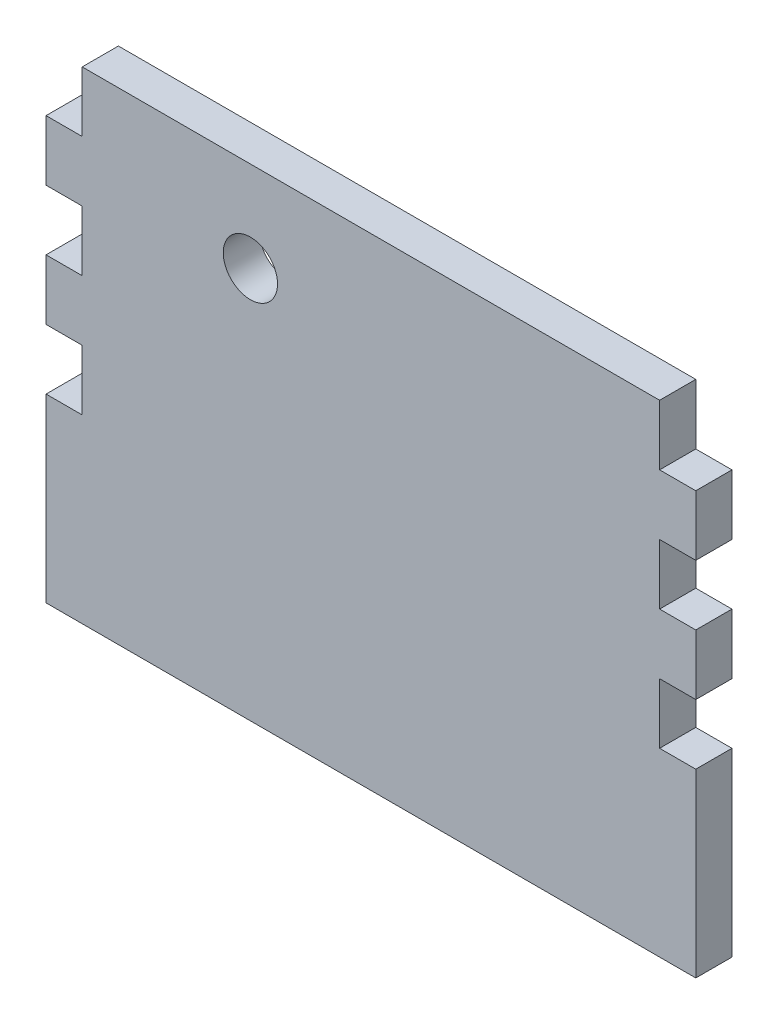
ISO-10303-21;
HEADER;
FILE_DESCRIPTION(('STEP AP214'),'2;1');
FILE_NAME('part.step','',(''),(''),'','','');
FILE_SCHEMA(('AUTOMOTIVE_DESIGN { 1 0 10303 214 1 1 1 1 }'));
ENDSEC;
DATA;
#1=APPLICATION_CONTEXT('core data for automotive mechanical design processes');
#2=APPLICATION_PROTOCOL_DEFINITION('international standard','automotive_design',2000,#1);
#3=PRODUCT_CONTEXT('',#1,'mechanical');
#4=PRODUCT('Part','Part','',(#3));
#5=PRODUCT_RELATED_PRODUCT_CATEGORY('part','',(#4));
#6=PRODUCT_DEFINITION_FORMATION('','',#4);
#7=PRODUCT_DEFINITION_CONTEXT('part definition',#1,'design');
#8=PRODUCT_DEFINITION('design','',#6,#7);
#9=PRODUCT_DEFINITION_SHAPE('','',#8);
#10=(LENGTH_UNIT() NAMED_UNIT(*) SI_UNIT(.MILLI.,.METRE.));
#11=(NAMED_UNIT(*) PLANE_ANGLE_UNIT() SI_UNIT($,.RADIAN.));
#12=(NAMED_UNIT(*) SI_UNIT($,.STERADIAN.) SOLID_ANGLE_UNIT());
#13=UNCERTAINTY_MEASURE_WITH_UNIT(LENGTH_MEASURE(1.E-05),#10,'distance_accuracy_value','');
#14=(GEOMETRIC_REPRESENTATION_CONTEXT(3) GLOBAL_UNCERTAINTY_ASSIGNED_CONTEXT((#13)) GLOBAL_UNIT_ASSIGNED_CONTEXT((#10,
#11,#12)) REPRESENTATION_CONTEXT('',''));
#15=CARTESIAN_POINT('',(0.,0.,0.));
#16=DIRECTION('',(0.,0.,1.));
#17=DIRECTION('',(1.,0.,0.));
#18=AXIS2_PLACEMENT_3D('',#15,#16,#17);
#19=CARTESIAN_POINT('',(-26.945,20.,3.));
#20=DIRECTION('',(1.,0.,0.));
#21=DIRECTION('',(0.,1.,0.));
#22=AXIS2_PLACEMENT_3D('',#19,#20,#21);
#23=PLANE('',#22);
#24=DIRECTION('',(0.,-1.,0.));
#25=VECTOR('',#24,1.);
#26=CARTESIAN_POINT('',(-26.945,20.,0.));
#27=LINE('',#26,#25);
#28=CARTESIAN_POINT('',(-26.945,4.99999999999999,0.));
#29=VERTEX_POINT('',#28);
#30=CARTESIAN_POINT('',(-26.945,0.,0.));
#31=VERTEX_POINT('',#30);
#32=EDGE_CURVE('E411',#29,#31,#27,.T.);
#33=ORIENTED_EDGE('',*,*,#32,.T.);
#34=DIRECTION('',(0.,0.,1.));
#35=VECTOR('',#34,1.);
#36=CARTESIAN_POINT('',(-26.945,0.,0.));
#37=LINE('',#36,#35);
#38=CARTESIAN_POINT('',(-26.945,0.,3.));
#39=VERTEX_POINT('',#38);
#40=EDGE_CURVE('E303',#31,#39,#37,.T.);
#41=ORIENTED_EDGE('',*,*,#40,.T.);
#42=DIRECTION('',(0.,-1.,0.));
#43=VECTOR('',#42,1.);
#44=CARTESIAN_POINT('',(-26.945,20.,3.));
#45=LINE('',#44,#43);
#46=CARTESIAN_POINT('',(-26.945,4.99999999999999,3.));
#47=VERTEX_POINT('',#46);
#48=EDGE_CURVE('E246',#47,#39,#45,.T.);
#49=ORIENTED_EDGE('',*,*,#48,.F.);
#50=DIRECTION('',(0.,0.,1.));
#51=VECTOR('',#50,1.);
#52=CARTESIAN_POINT('',(-26.945,4.99999999999999,0.));
#53=LINE('',#52,#51);
#54=EDGE_CURVE('E336',#29,#47,#53,.T.);
#55=ORIENTED_EDGE('',*,*,#54,.F.);
#56=EDGE_LOOP('',(#33,#41,#49,#55));
#57=FACE_BOUND('',#56,.T.);
#58=ADVANCED_FACE('F33',(#57),#23,.F.);
#59=CARTESIAN_POINT('',(-26.945,15.,0.));
#60=VERTEX_POINT('',#59);
#61=CARTESIAN_POINT('',(-26.945,9.99999999999999,0.));
#62=VERTEX_POINT('',#61);
#63=EDGE_CURVE('E257',#60,#62,#27,.T.);
#64=ORIENTED_EDGE('',*,*,#63,.T.);
#65=DIRECTION('',(0.,0.,1.));
#66=VECTOR('',#65,1.);
#67=CARTESIAN_POINT('',(-26.945,9.99999999999999,0.));
#68=LINE('',#67,#66);
#69=CARTESIAN_POINT('',(-26.945,9.99999999999999,3.));
#70=VERTEX_POINT('',#69);
#71=EDGE_CURVE('E268',#62,#70,#68,.T.);
#72=ORIENTED_EDGE('',*,*,#71,.T.);
#73=CARTESIAN_POINT('',(-26.945,15.,3.));
#74=VERTEX_POINT('',#73);
#75=EDGE_CURVE('E248',#74,#70,#45,.T.);
#76=ORIENTED_EDGE('',*,*,#75,.F.);
#77=DIRECTION('',(0.,0.,1.));
#78=VECTOR('',#77,1.);
#79=CARTESIAN_POINT('',(-26.945,15.,0.));
#80=LINE('',#79,#78);
#81=EDGE_CURVE('E258',#60,#74,#80,.T.);
#82=ORIENTED_EDGE('',*,*,#81,.F.);
#83=EDGE_LOOP('',(#64,#72,#76,#82));
#84=FACE_BOUND('',#83,.T.);
#85=ADVANCED_FACE('F418',(#84),#23,.F.);
#86=CARTESIAN_POINT('',(26.945,20.,3.));
#87=DIRECTION('',(1.,0.,0.));
#88=DIRECTION('',(0.,1.,0.));
#89=AXIS2_PLACEMENT_3D('',#86,#87,#88);
#90=PLANE('',#89);
#91=DIRECTION('',(0.,0.,1.));
#92=VECTOR('',#91,1.);
#93=CARTESIAN_POINT('',(26.945,-5.00000000000001,0.));
#94=LINE('',#93,#92);
#95=CARTESIAN_POINT('',(26.945,-5.00000000000001,0.));
#96=VERTEX_POINT('',#95);
#97=CARTESIAN_POINT('',(26.945,-5.00000000000001,3.));
#98=VERTEX_POINT('',#97);
#99=EDGE_CURVE('E279',#96,#98,#94,.T.);
#100=ORIENTED_EDGE('',*,*,#99,.T.);
#101=DIRECTION('',(0.,-1.,0.));
#102=VECTOR('',#101,1.);
#103=CARTESIAN_POINT('',(26.945,20.,3.));
#104=LINE('',#103,#102);
#105=CARTESIAN_POINT('',(26.945,-20.,3.));
#106=VERTEX_POINT('',#105);
#107=EDGE_CURVE('E251',#98,#106,#104,.T.);
#108=ORIENTED_EDGE('',*,*,#107,.T.);
#109=DIRECTION('',(0.,0.,-1.));
#110=VECTOR('',#109,1.);
#111=CARTESIAN_POINT('',(26.945,-20.,3.));
#112=LINE('',#111,#110);
#113=CARTESIAN_POINT('',(26.945,-20.,0.));
#114=VERTEX_POINT('',#113);
#115=EDGE_CURVE('E37',#106,#114,#112,.T.);
#116=ORIENTED_EDGE('',*,*,#115,.T.);
#117=DIRECTION('',(0.,-1.,0.));
#118=VECTOR('',#117,1.);
#119=CARTESIAN_POINT('',(26.945,20.,0.));
#120=LINE('',#119,#118);
#121=EDGE_CURVE('E226',#96,#114,#120,.T.);
#122=ORIENTED_EDGE('',*,*,#121,.F.);
#123=EDGE_LOOP('',(#100,#108,#116,#122));
#124=FACE_BOUND('',#123,.T.);
#125=ADVANCED_FACE('F402',(#124),#90,.T.);
#126=DIRECTION('',(0.,0.,1.));
#127=VECTOR('',#126,1.);
#128=CARTESIAN_POINT('',(26.945,0.,0.));
#129=LINE('',#128,#127);
#130=CARTESIAN_POINT('',(26.945,0.,0.));
#131=VERTEX_POINT('',#130);
#132=CARTESIAN_POINT('',(26.945,0.,3.));
#133=VERTEX_POINT('',#132);
#134=EDGE_CURVE('E272',#131,#133,#129,.T.);
#135=ORIENTED_EDGE('',*,*,#134,.F.);
#136=CARTESIAN_POINT('',(26.945,4.99999999999999,0.));
#137=VERTEX_POINT('',#136);
#138=EDGE_CURVE('E224',#137,#131,#120,.T.);
#139=ORIENTED_EDGE('',*,*,#138,.F.);
#140=DIRECTION('',(0.,0.,1.));
#141=VECTOR('',#140,1.);
#142=CARTESIAN_POINT('',(26.945,4.99999999999999,0.));
#143=LINE('',#142,#141);
#144=CARTESIAN_POINT('',(26.945,4.99999999999999,3.));
#145=VERTEX_POINT('',#144);
#146=EDGE_CURVE('E333',#137,#145,#143,.T.);
#147=ORIENTED_EDGE('',*,*,#146,.T.);
#148=EDGE_CURVE('E253',#145,#133,#104,.T.);
#149=ORIENTED_EDGE('',*,*,#148,.T.);
#150=EDGE_LOOP('',(#135,#139,#147,#149));
#151=FACE_BOUND('',#150,.T.);
#152=ADVANCED_FACE('F390',(#151),#90,.T.);
#153=CARTESIAN_POINT('',(-26.945,20.,3.));
#154=DIRECTION('',(0.,1.,0.));
#155=DIRECTION('',(0.,0.,1.));
#156=AXIS2_PLACEMENT_3D('',#153,#154,#155);
#157=PLANE('',#156);
#158=DIRECTION('',(0.,0.,1.));
#159=VECTOR('',#158,1.);
#160=CARTESIAN_POINT('',(23.945,20.,0.));
#161=LINE('',#160,#159);
#162=CARTESIAN_POINT('',(23.945,20.,0.));
#163=VERTEX_POINT('',#162);
#164=CARTESIAN_POINT('',(23.945,20.,3.));
#165=VERTEX_POINT('',#164);
#166=EDGE_CURVE('E320',#163,#165,#161,.T.);
#167=ORIENTED_EDGE('',*,*,#166,.F.);
#168=DIRECTION('',(1.,0.,0.));
#169=VECTOR('',#168,1.);
#170=CARTESIAN_POINT('',(-26.945,20.,0.));
#171=LINE('',#170,#169);
#172=CARTESIAN_POINT('',(-23.945,20.,0.));
#173=VERTEX_POINT('',#172);
#174=EDGE_CURVE('E232',#173,#163,#171,.T.);
#175=ORIENTED_EDGE('',*,*,#174,.F.);
#176=DIRECTION('',(0.,0.,1.));
#177=VECTOR('',#176,1.);
#178=CARTESIAN_POINT('',(-23.945,20.,0.));
#179=LINE('',#178,#177);
#180=CARTESIAN_POINT('',(-23.945,20.,3.));
#181=VERTEX_POINT('',#180);
#182=EDGE_CURVE('E237',#173,#181,#179,.T.);
#183=ORIENTED_EDGE('',*,*,#182,.T.);
#184=DIRECTION('',(1.,0.,0.));
#185=VECTOR('',#184,1.);
#186=CARTESIAN_POINT('',(-26.945,20.,3.));
#187=LINE('',#186,#185);
#188=EDGE_CURVE('E254',#181,#165,#187,.T.);
#189=ORIENTED_EDGE('',*,*,#188,.T.);
#190=EDGE_LOOP('',(#167,#175,#183,#189));
#191=FACE_BOUND('',#190,.T.);
#192=ADVANCED_FACE('F35',(#191),#157,.T.);
#193=CARTESIAN_POINT('',(-26.945,-5.00000000000001,3.));
#194=VERTEX_POINT('',#193);
#195=CARTESIAN_POINT('',(-26.945,-20.,3.));
#196=VERTEX_POINT('',#195);
#197=EDGE_CURVE('E244',#194,#196,#45,.T.);
#198=ORIENTED_EDGE('',*,*,#197,.F.);
#199=DIRECTION('',(0.,0.,1.));
#200=VECTOR('',#199,1.);
#201=CARTESIAN_POINT('',(-26.945,-5.00000000000001,0.));
#202=LINE('',#201,#200);
#203=CARTESIAN_POINT('',(-26.945,-5.00000000000001,0.));
#204=VERTEX_POINT('',#203);
#205=EDGE_CURVE('E296',#204,#194,#202,.T.);
#206=ORIENTED_EDGE('',*,*,#205,.F.);
#207=CARTESIAN_POINT('',(-26.945,-20.,0.));
#208=VERTEX_POINT('',#207);
#209=EDGE_CURVE('E228',#204,#208,#27,.T.);
#210=ORIENTED_EDGE('',*,*,#209,.T.);
#211=DIRECTION('',(0.,0.,-1.));
#212=VECTOR('',#211,1.);
#213=CARTESIAN_POINT('',(-26.945,-20.,3.));
#214=LINE('',#213,#212);
#215=EDGE_CURVE('E11',#196,#208,#214,.T.);
#216=ORIENTED_EDGE('',*,*,#215,.F.);
#217=EDGE_LOOP('',(#198,#206,#210,#216));
#218=FACE_BOUND('',#217,.T.);
#219=ADVANCED_FACE('F455',(#218),#23,.F.);
#220=CARTESIAN_POINT('',(-26.945,-20.,3.));
#221=DIRECTION('',(0.,1.,0.));
#222=DIRECTION('',(0.,0.,1.));
#223=AXIS2_PLACEMENT_3D('',#220,#221,#222);
#224=PLANE('',#223);
#225=DIRECTION('',(1.,0.,0.));
#226=VECTOR('',#225,1.);
#227=CARTESIAN_POINT('',(-26.945,-20.,0.));
#228=LINE('',#227,#226);
#229=EDGE_CURVE('E223',#208,#114,#228,.T.);
#230=ORIENTED_EDGE('',*,*,#229,.T.);
#231=ORIENTED_EDGE('',*,*,#115,.F.);
#232=DIRECTION('',(1.,0.,0.));
#233=VECTOR('',#232,1.);
#234=CARTESIAN_POINT('',(-26.945,-20.,3.));
#235=LINE('',#234,#233);
#236=EDGE_CURVE('E247',#196,#106,#235,.T.);
#237=ORIENTED_EDGE('',*,*,#236,.F.);
#238=ORIENTED_EDGE('',*,*,#215,.T.);
#239=EDGE_LOOP('',(#230,#231,#237,#238));
#240=FACE_BOUND('',#239,.T.);
#241=ADVANCED_FACE('F406',(#240),#224,.F.);
#242=DIRECTION('',(0.,0.,1.));
#243=VECTOR('',#242,1.);
#244=CARTESIAN_POINT('',(26.945,15.,0.));
#245=LINE('',#244,#243);
#246=CARTESIAN_POINT('',(26.945,15.,0.));
#247=VERTEX_POINT('',#246);
#248=CARTESIAN_POINT('',(26.945,15.,3.));
#249=VERTEX_POINT('',#248);
#250=EDGE_CURVE('E324',#247,#249,#245,.T.);
#251=ORIENTED_EDGE('',*,*,#250,.T.);
#252=CARTESIAN_POINT('',(26.945,9.99999999999999,3.));
#253=VERTEX_POINT('',#252);
#254=EDGE_CURVE('E214',#249,#253,#104,.T.);
#255=ORIENTED_EDGE('',*,*,#254,.T.);
#256=DIRECTION('',(0.,0.,1.));
#257=VECTOR('',#256,1.);
#258=CARTESIAN_POINT('',(26.945,9.99999999999999,0.));
#259=LINE('',#258,#257);
#260=CARTESIAN_POINT('',(26.945,9.99999999999999,0.));
#261=VERTEX_POINT('',#260);
#262=EDGE_CURVE('E198',#261,#253,#259,.T.);
#263=ORIENTED_EDGE('',*,*,#262,.F.);
#264=EDGE_CURVE('E212',#247,#261,#120,.T.);
#265=ORIENTED_EDGE('',*,*,#264,.F.);
#266=EDGE_LOOP('',(#251,#255,#263,#265));
#267=FACE_BOUND('',#266,.T.);
#268=ADVANCED_FACE('F211',(#267),#90,.T.);
#269=CARTESIAN_POINT('',(0.,0.,3.));
#270=DIRECTION('',(0.,0.,-1.));
#271=DIRECTION('',(-1.,0.,0.));
#272=AXIS2_PLACEMENT_3D('',#269,#270,#271);
#273=PLANE('',#272);
#274=CARTESIAN_POINT('',(-9.995,12.5,3.));
#275=DIRECTION('',(0.,0.,1.));
#276=DIRECTION('',(1.,0.,0.));
#277=AXIS2_PLACEMENT_3D('',#274,#275,#276);
#278=CIRCLE('',#277,2.25);
#279=CARTESIAN_POINT('',(-7.745,12.5,3.));
#280=VERTEX_POINT('',#279);
#281=EDGE_CURVE('E306',#280,#280,#278,.T.);
#282=ORIENTED_EDGE('',*,*,#281,.F.);
#283=EDGE_LOOP('',(#282));
#284=FACE_BOUND('',#283,.T.);
#285=ORIENTED_EDGE('',*,*,#107,.F.);
#286=DIRECTION('',(1.,0.,0.));
#287=VECTOR('',#286,1.);
#288=CARTESIAN_POINT('',(26.945,-5.00000000000001,3.));
#289=LINE('',#288,#287);
#290=CARTESIAN_POINT('',(23.945,-5.00000000000001,3.));
#291=VERTEX_POINT('',#290);
#292=EDGE_CURVE('E283',#291,#98,#289,.T.);
#293=ORIENTED_EDGE('',*,*,#292,.F.);
#294=DIRECTION('',(0.,-1.,0.));
#295=VECTOR('',#294,1.);
#296=CARTESIAN_POINT('',(23.945,0.,3.));
#297=LINE('',#296,#295);
#298=CARTESIAN_POINT('',(23.945,0.,3.));
#299=VERTEX_POINT('',#298);
#300=EDGE_CURVE('E286',#299,#291,#297,.T.);
#301=ORIENTED_EDGE('',*,*,#300,.F.);
#302=DIRECTION('',(-1.,0.,0.));
#303=VECTOR('',#302,1.);
#304=CARTESIAN_POINT('',(26.945,0.,3.));
#305=LINE('',#304,#303);
#306=EDGE_CURVE('E289',#133,#299,#305,.T.);
#307=ORIENTED_EDGE('',*,*,#306,.F.);
#308=ORIENTED_EDGE('',*,*,#148,.F.);
#309=DIRECTION('',(1.,0.,0.));
#310=VECTOR('',#309,1.);
#311=CARTESIAN_POINT('',(26.945,4.99999999999999,3.));
#312=LINE('',#311,#310);
#313=CARTESIAN_POINT('',(23.945,4.99999999999999,3.));
#314=VERTEX_POINT('',#313);
#315=EDGE_CURVE('E205',#314,#145,#312,.T.);
#316=ORIENTED_EDGE('',*,*,#315,.F.);
#317=DIRECTION('',(0.,-1.,0.));
#318=VECTOR('',#317,1.);
#319=CARTESIAN_POINT('',(23.945,4.99999999999999,3.));
#320=LINE('',#319,#318);
#321=CARTESIAN_POINT('',(23.945,9.99999999999999,3.));
#322=VERTEX_POINT('',#321);
#323=EDGE_CURVE('E372',#322,#314,#320,.T.);
#324=ORIENTED_EDGE('',*,*,#323,.F.);
#325=DIRECTION('',(-1.,0.,0.));
#326=VECTOR('',#325,1.);
#327=CARTESIAN_POINT('',(26.945,9.99999999999999,3.));
#328=LINE('',#327,#326);
#329=EDGE_CURVE('E364',#253,#322,#328,.T.);
#330=ORIENTED_EDGE('',*,*,#329,.F.);
#331=ORIENTED_EDGE('',*,*,#254,.F.);
#332=DIRECTION('',(1.,0.,0.));
#333=VECTOR('',#332,1.);
#334=CARTESIAN_POINT('',(26.945,15.,3.));
#335=LINE('',#334,#333);
#336=CARTESIAN_POINT('',(23.945,15.,3.));
#337=VERTEX_POINT('',#336);
#338=EDGE_CURVE('E327',#337,#249,#335,.T.);
#339=ORIENTED_EDGE('',*,*,#338,.F.);
#340=DIRECTION('',(0.,-1.,0.));
#341=VECTOR('',#340,1.);
#342=CARTESIAN_POINT('',(23.945,20.,3.));
#343=LINE('',#342,#341);
#344=EDGE_CURVE('E330',#165,#337,#343,.T.);
#345=ORIENTED_EDGE('',*,*,#344,.F.);
#346=ORIENTED_EDGE('',*,*,#188,.F.);
#347=DIRECTION('',(0.,1.,0.));
#348=VECTOR('',#347,1.);
#349=CARTESIAN_POINT('',(-23.945,20.,3.));
#350=LINE('',#349,#348);
#351=CARTESIAN_POINT('',(-23.945,15.,3.));
#352=VERTEX_POINT('',#351);
#353=EDGE_CURVE('E262',#352,#181,#350,.T.);
#354=ORIENTED_EDGE('',*,*,#353,.F.);
#355=DIRECTION('',(1.,0.,0.));
#356=VECTOR('',#355,1.);
#357=CARTESIAN_POINT('',(-26.945,15.,3.));
#358=LINE('',#357,#356);
#359=EDGE_CURVE('E265',#74,#352,#358,.T.);
#360=ORIENTED_EDGE('',*,*,#359,.F.);
#361=ORIENTED_EDGE('',*,*,#75,.T.);
#362=DIRECTION('',(-1.,0.,0.));
#363=VECTOR('',#362,1.);
#364=CARTESIAN_POINT('',(-26.945,9.99999999999999,3.));
#365=LINE('',#364,#363);
#366=CARTESIAN_POINT('',(-23.945,9.99999999999999,3.));
#367=VERTEX_POINT('',#366);
#368=EDGE_CURVE('E345',#367,#70,#365,.T.);
#369=ORIENTED_EDGE('',*,*,#368,.F.);
#370=DIRECTION('',(0.,1.,0.));
#371=VECTOR('',#370,1.);
#372=CARTESIAN_POINT('',(-23.945,4.99999999999999,3.));
#373=LINE('',#372,#371);
#374=CARTESIAN_POINT('',(-23.945,4.99999999999999,3.));
#375=VERTEX_POINT('',#374);
#376=EDGE_CURVE('E348',#375,#367,#373,.T.);
#377=ORIENTED_EDGE('',*,*,#376,.F.);
#378=DIRECTION('',(1.,0.,0.));
#379=VECTOR('',#378,1.);
#380=CARTESIAN_POINT('',(-26.945,4.99999999999999,3.));
#381=LINE('',#380,#379);
#382=EDGE_CURVE('E326',#47,#375,#381,.T.);
#383=ORIENTED_EDGE('',*,*,#382,.F.);
#384=ORIENTED_EDGE('',*,*,#48,.T.);
#385=DIRECTION('',(-1.,0.,0.));
#386=VECTOR('',#385,1.);
#387=CARTESIAN_POINT('',(-26.945,0.,3.));
#388=LINE('',#387,#386);
#389=CARTESIAN_POINT('',(-23.945,0.,3.));
#390=VERTEX_POINT('',#389);
#391=EDGE_CURVE('E307',#390,#39,#388,.T.);
#392=ORIENTED_EDGE('',*,*,#391,.F.);
#393=DIRECTION('',(0.,1.,0.));
#394=VECTOR('',#393,1.);
#395=CARTESIAN_POINT('',(-23.945,0.,3.));
#396=LINE('',#395,#394);
#397=CARTESIAN_POINT('',(-23.945,-5.00000000000001,3.));
#398=VERTEX_POINT('',#397);
#399=EDGE_CURVE('E310',#398,#390,#396,.T.);
#400=ORIENTED_EDGE('',*,*,#399,.F.);
#401=DIRECTION('',(1.,0.,0.));
#402=VECTOR('',#401,1.);
#403=CARTESIAN_POINT('',(-26.945,-5.00000000000001,3.));
#404=LINE('',#403,#402);
#405=EDGE_CURVE('E282',#194,#398,#404,.T.);
#406=ORIENTED_EDGE('',*,*,#405,.F.);
#407=ORIENTED_EDGE('',*,*,#197,.T.);
#408=ORIENTED_EDGE('',*,*,#236,.T.);
#409=EDGE_LOOP('',(#285,#293,#301,#307,#308,#316,#324,#330,#331,#339,#345,#346,#354,#360,#361,
#369,#377,#383,#384,#392,#400,#406,#407,#408));
#410=FACE_BOUND('',#409,.T.);
#411=ADVANCED_FACE('F394',(#284,#410),#273,.F.);
#412=CARTESIAN_POINT('',(0.,0.,0.));
#413=DIRECTION('',(0.,0.,-1.));
#414=DIRECTION('',(-1.,0.,0.));
#415=AXIS2_PLACEMENT_3D('',#412,#413,#414);
#416=PLANE('',#415);
#417=DIRECTION('',(1.,0.,0.));
#418=VECTOR('',#417,1.);
#419=CARTESIAN_POINT('',(26.945,-5.00000000000001,0.));
#420=LINE('',#419,#418);
#421=CARTESIAN_POINT('',(23.945,-5.00000000000001,0.));
#422=VERTEX_POINT('',#421);
#423=EDGE_CURVE('E275',#422,#96,#420,.T.);
#424=ORIENTED_EDGE('',*,*,#423,.T.);
#425=ORIENTED_EDGE('',*,*,#121,.T.);
#426=ORIENTED_EDGE('',*,*,#229,.F.);
#427=ORIENTED_EDGE('',*,*,#209,.F.);
#428=DIRECTION('',(1.,0.,0.));
#429=VECTOR('',#428,1.);
#430=CARTESIAN_POINT('',(-26.945,-5.00000000000001,0.));
#431=LINE('',#430,#429);
#432=CARTESIAN_POINT('',(-23.945,-5.00000000000001,0.));
#433=VERTEX_POINT('',#432);
#434=EDGE_CURVE('E309',#204,#433,#431,.T.);
#435=ORIENTED_EDGE('',*,*,#434,.T.);
#436=DIRECTION('',(0.,1.,0.));
#437=VECTOR('',#436,1.);
#438=CARTESIAN_POINT('',(-23.945,0.,0.));
#439=LINE('',#438,#437);
#440=CARTESIAN_POINT('',(-23.945,0.,0.));
#441=VERTEX_POINT('',#440);
#442=EDGE_CURVE('E56',#433,#441,#439,.T.);
#443=ORIENTED_EDGE('',*,*,#442,.T.);
#444=DIRECTION('',(-1.,0.,0.));
#445=VECTOR('',#444,1.);
#446=CARTESIAN_POINT('',(-26.945,0.,0.));
#447=LINE('',#446,#445);
#448=EDGE_CURVE('E299',#441,#31,#447,.T.);
#449=ORIENTED_EDGE('',*,*,#448,.T.);
#450=ORIENTED_EDGE('',*,*,#32,.F.);
#451=DIRECTION('',(1.,0.,0.));
#452=VECTOR('',#451,1.);
#453=CARTESIAN_POINT('',(-26.945,4.99999999999999,0.));
#454=LINE('',#453,#452);
#455=CARTESIAN_POINT('',(-23.945,4.99999999999999,0.));
#456=VERTEX_POINT('',#455);
#457=EDGE_CURVE('E347',#29,#456,#454,.T.);
#458=ORIENTED_EDGE('',*,*,#457,.T.);
#459=DIRECTION('',(0.,1.,0.));
#460=VECTOR('',#459,1.);
#461=CARTESIAN_POINT('',(-23.945,4.99999999999999,0.));
#462=LINE('',#461,#460);
#463=CARTESIAN_POINT('',(-23.945,9.99999999999999,0.));
#464=VERTEX_POINT('',#463);
#465=EDGE_CURVE('E355',#456,#464,#462,.T.);
#466=ORIENTED_EDGE('',*,*,#465,.T.);
#467=DIRECTION('',(-1.,0.,0.));
#468=VECTOR('',#467,1.);
#469=CARTESIAN_POINT('',(-26.945,9.99999999999999,0.));
#470=LINE('',#469,#468);
#471=EDGE_CURVE('E339',#464,#62,#470,.T.);
#472=ORIENTED_EDGE('',*,*,#471,.T.);
#473=ORIENTED_EDGE('',*,*,#63,.F.);
#474=DIRECTION('',(1.,0.,0.));
#475=VECTOR('',#474,1.);
#476=CARTESIAN_POINT('',(-26.945,15.,0.));
#477=LINE('',#476,#475);
#478=CARTESIAN_POINT('',(-23.945,15.,0.));
#479=VERTEX_POINT('',#478);
#480=EDGE_CURVE('E264',#60,#479,#477,.T.);
#481=ORIENTED_EDGE('',*,*,#480,.T.);
#482=DIRECTION('',(0.,1.,0.));
#483=VECTOR('',#482,1.);
#484=CARTESIAN_POINT('',(-23.945,20.,0.));
#485=LINE('',#484,#483);
#486=EDGE_CURVE('E260',#479,#173,#485,.T.);
#487=ORIENTED_EDGE('',*,*,#486,.T.);
#488=ORIENTED_EDGE('',*,*,#174,.T.);
#489=DIRECTION('',(0.,-1.,0.));
#490=VECTOR('',#489,1.);
#491=CARTESIAN_POINT('',(23.945,20.,0.));
#492=LINE('',#491,#490);
#493=CARTESIAN_POINT('',(23.945,15.,0.));
#494=VERTEX_POINT('',#493);
#495=EDGE_CURVE('E329',#163,#494,#492,.T.);
#496=ORIENTED_EDGE('',*,*,#495,.T.);
#497=DIRECTION('',(1.,0.,0.));
#498=VECTOR('',#497,1.);
#499=CARTESIAN_POINT('',(26.945,15.,0.));
#500=LINE('',#499,#498);
#501=EDGE_CURVE('E222',#494,#247,#500,.T.);
#502=ORIENTED_EDGE('',*,*,#501,.T.);
#503=ORIENTED_EDGE('',*,*,#264,.T.);
#504=DIRECTION('',(-1.,0.,0.));
#505=VECTOR('',#504,1.);
#506=CARTESIAN_POINT('',(26.945,9.99999999999999,0.));
#507=LINE('',#506,#505);
#508=CARTESIAN_POINT('',(23.945,9.99999999999999,0.));
#509=VERTEX_POINT('',#508);
#510=EDGE_CURVE('E194',#261,#509,#507,.T.);
#511=ORIENTED_EDGE('',*,*,#510,.T.);
#512=DIRECTION('',(0.,-1.,0.));
#513=VECTOR('',#512,1.);
#514=CARTESIAN_POINT('',(23.945,4.99999999999999,0.));
#515=LINE('',#514,#513);
#516=CARTESIAN_POINT('',(23.945,4.99999999999999,0.));
#517=VERTEX_POINT('',#516);
#518=EDGE_CURVE('E204',#509,#517,#515,.T.);
#519=ORIENTED_EDGE('',*,*,#518,.T.);
#520=DIRECTION('',(1.,0.,0.));
#521=VECTOR('',#520,1.);
#522=CARTESIAN_POINT('',(26.945,4.99999999999999,0.));
#523=LINE('',#522,#521);
#524=EDGE_CURVE('E215',#517,#137,#523,.T.);
#525=ORIENTED_EDGE('',*,*,#524,.T.);
#526=ORIENTED_EDGE('',*,*,#138,.T.);
#527=DIRECTION('',(-1.,0.,0.));
#528=VECTOR('',#527,1.);
#529=CARTESIAN_POINT('',(26.945,0.,0.));
#530=LINE('',#529,#528);
#531=CARTESIAN_POINT('',(23.945,0.,0.));
#532=VERTEX_POINT('',#531);
#533=EDGE_CURVE('E285',#131,#532,#530,.T.);
#534=ORIENTED_EDGE('',*,*,#533,.T.);
#535=DIRECTION('',(0.,-1.,0.));
#536=VECTOR('',#535,1.);
#537=CARTESIAN_POINT('',(23.945,0.,0.));
#538=LINE('',#537,#536);
#539=EDGE_CURVE('E48',#532,#422,#538,.T.);
#540=ORIENTED_EDGE('',*,*,#539,.T.);
#541=EDGE_LOOP('',(#424,#425,#426,#427,#435,#443,#449,#450,#458,#466,#472,#473,#481,#487,#488,
#496,#502,#503,#511,#519,#525,#526,#534,#540));
#542=FACE_BOUND('',#541,.T.);
#543=CARTESIAN_POINT('',(-9.995,12.5,0.));
#544=DIRECTION('',(0.,0.,1.));
#545=DIRECTION('',(1.,0.,0.));
#546=AXIS2_PLACEMENT_3D('',#543,#544,#545);
#547=CIRCLE('',#546,2.25);
#548=CARTESIAN_POINT('',(-7.745,12.5,0.));
#549=VERTEX_POINT('',#548);
#550=EDGE_CURVE('E362',#549,#549,#547,.T.);
#551=ORIENTED_EDGE('',*,*,#550,.T.);
#552=EDGE_LOOP('',(#551));
#553=FACE_BOUND('',#552,.T.);
#554=ADVANCED_FACE('F219',(#542,#553),#416,.T.);
#555=CARTESIAN_POINT('',(-23.945,20.,0.));
#556=DIRECTION('',(1.,0.,0.));
#557=DIRECTION('',(0.,0.,-1.));
#558=AXIS2_PLACEMENT_3D('',#555,#556,#557);
#559=PLANE('',#558);
#560=ORIENTED_EDGE('',*,*,#353,.T.);
#561=ORIENTED_EDGE('',*,*,#182,.F.);
#562=ORIENTED_EDGE('',*,*,#486,.F.);
#563=DIRECTION('',(0.,0.,1.));
#564=VECTOR('',#563,1.);
#565=CARTESIAN_POINT('',(-23.945,15.,0.));
#566=LINE('',#565,#564);
#567=EDGE_CURVE('E241',#479,#352,#566,.T.);
#568=ORIENTED_EDGE('',*,*,#567,.T.);
#569=EDGE_LOOP('',(#560,#561,#562,#568));
#570=FACE_BOUND('',#569,.T.);
#571=ADVANCED_FACE('F490',(#570),#559,.F.);
#572=CARTESIAN_POINT('',(-26.945,15.,0.));
#573=DIRECTION('',(0.,-1.,0.));
#574=DIRECTION('',(0.,0.,-1.));
#575=AXIS2_PLACEMENT_3D('',#572,#573,#574);
#576=PLANE('',#575);
#577=ORIENTED_EDGE('',*,*,#359,.T.);
#578=ORIENTED_EDGE('',*,*,#567,.F.);
#579=ORIENTED_EDGE('',*,*,#480,.F.);
#580=ORIENTED_EDGE('',*,*,#81,.T.);
#581=EDGE_LOOP('',(#577,#578,#579,#580));
#582=FACE_BOUND('',#581,.T.);
#583=ADVANCED_FACE('F493',(#582),#576,.F.);
#584=CARTESIAN_POINT('',(-9.995,12.5,0.));
#585=DIRECTION('',(0.,0.,1.));
#586=DIRECTION('',(1.,0.,0.));
#587=AXIS2_PLACEMENT_3D('',#584,#585,#586);
#588=CYLINDRICAL_SURFACE('',#587,2.25);
#589=ORIENTED_EDGE('',*,*,#550,.F.);
#590=EDGE_LOOP('',(#589));
#591=FACE_BOUND('',#590,.T.);
#592=ORIENTED_EDGE('',*,*,#281,.T.);
#593=EDGE_LOOP('',(#592));
#594=FACE_BOUND('',#593,.T.);
#595=ADVANCED_FACE('F497',(#591,#594),#588,.F.);
#596=CARTESIAN_POINT('',(26.945,4.99999999999999,0.));
#597=DIRECTION('',(0.,-1.,0.));
#598=DIRECTION('',(0.,0.,-1.));
#599=AXIS2_PLACEMENT_3D('',#596,#597,#598);
#600=PLANE('',#599);
#601=ORIENTED_EDGE('',*,*,#315,.T.);
#602=ORIENTED_EDGE('',*,*,#146,.F.);
#603=ORIENTED_EDGE('',*,*,#524,.F.);
#604=DIRECTION('',(0.,0.,1.));
#605=VECTOR('',#604,1.);
#606=CARTESIAN_POINT('',(23.945,4.99999999999999,0.));
#607=LINE('',#606,#605);
#608=EDGE_CURVE('E367',#517,#314,#607,.T.);
#609=ORIENTED_EDGE('',*,*,#608,.T.);
#610=EDGE_LOOP('',(#601,#602,#603,#609));
#611=FACE_BOUND('',#610,.T.);
#612=ADVANCED_FACE('F385',(#611),#600,.F.);
#613=CARTESIAN_POINT('',(23.945,4.99999999999999,0.));
#614=DIRECTION('',(-1.,0.,0.));
#615=DIRECTION('',(0.,0.,1.));
#616=AXIS2_PLACEMENT_3D('',#613,#614,#615);
#617=PLANE('',#616);
#618=ORIENTED_EDGE('',*,*,#323,.T.);
#619=ORIENTED_EDGE('',*,*,#608,.F.);
#620=ORIENTED_EDGE('',*,*,#518,.F.);
#621=DIRECTION('',(0.,0.,1.));
#622=VECTOR('',#621,1.);
#623=CARTESIAN_POINT('',(23.945,9.99999999999999,0.));
#624=LINE('',#623,#622);
#625=EDGE_CURVE('E200',#509,#322,#624,.T.);
#626=ORIENTED_EDGE('',*,*,#625,.T.);
#627=EDGE_LOOP('',(#618,#619,#620,#626));
#628=FACE_BOUND('',#627,.T.);
#629=ADVANCED_FACE('F381',(#628),#617,.F.);
#630=CARTESIAN_POINT('',(26.945,9.99999999999999,0.));
#631=DIRECTION('',(0.,1.,0.));
#632=DIRECTION('',(0.,0.,1.));
#633=AXIS2_PLACEMENT_3D('',#630,#631,#632);
#634=PLANE('',#633);
#635=ORIENTED_EDGE('',*,*,#329,.T.);
#636=ORIENTED_EDGE('',*,*,#625,.F.);
#637=ORIENTED_EDGE('',*,*,#510,.F.);
#638=ORIENTED_EDGE('',*,*,#262,.T.);
#639=EDGE_LOOP('',(#635,#636,#637,#638));
#640=FACE_BOUND('',#639,.T.);
#641=ADVANCED_FACE('F197',(#640),#634,.F.);
#642=CARTESIAN_POINT('',(26.945,15.,0.));
#643=DIRECTION('',(0.,-1.,0.));
#644=DIRECTION('',(0.,0.,-1.));
#645=AXIS2_PLACEMENT_3D('',#642,#643,#644);
#646=PLANE('',#645);
#647=ORIENTED_EDGE('',*,*,#338,.T.);
#648=ORIENTED_EDGE('',*,*,#250,.F.);
#649=ORIENTED_EDGE('',*,*,#501,.F.);
#650=DIRECTION('',(0.,0.,1.));
#651=VECTOR('',#650,1.);
#652=CARTESIAN_POINT('',(23.945,15.,0.));
#653=LINE('',#652,#651);
#654=EDGE_CURVE('E322',#494,#337,#653,.T.);
#655=ORIENTED_EDGE('',*,*,#654,.T.);
#656=EDGE_LOOP('',(#647,#648,#649,#655));
#657=FACE_BOUND('',#656,.T.);
#658=ADVANCED_FACE('F540',(#657),#646,.F.);
#659=CARTESIAN_POINT('',(23.945,20.,0.));
#660=DIRECTION('',(-1.,0.,0.));
#661=DIRECTION('',(0.,0.,1.));
#662=AXIS2_PLACEMENT_3D('',#659,#660,#661);
#663=PLANE('',#662);
#664=ORIENTED_EDGE('',*,*,#344,.T.);
#665=ORIENTED_EDGE('',*,*,#654,.F.);
#666=ORIENTED_EDGE('',*,*,#495,.F.);
#667=ORIENTED_EDGE('',*,*,#166,.T.);
#668=EDGE_LOOP('',(#664,#665,#666,#667));
#669=FACE_BOUND('',#668,.T.);
#670=ADVANCED_FACE('F451',(#669),#663,.F.);
#671=CARTESIAN_POINT('',(-26.945,9.99999999999999,0.));
#672=DIRECTION('',(0.,1.,0.));
#673=DIRECTION('',(0.,0.,1.));
#674=AXIS2_PLACEMENT_3D('',#671,#672,#673);
#675=PLANE('',#674);
#676=ORIENTED_EDGE('',*,*,#368,.T.);
#677=ORIENTED_EDGE('',*,*,#71,.F.);
#678=ORIENTED_EDGE('',*,*,#471,.F.);
#679=DIRECTION('',(0.,0.,1.));
#680=VECTOR('',#679,1.);
#681=CARTESIAN_POINT('',(-23.945,9.99999999999999,0.));
#682=LINE('',#681,#680);
#683=EDGE_CURVE('E341',#464,#367,#682,.T.);
#684=ORIENTED_EDGE('',*,*,#683,.T.);
#685=EDGE_LOOP('',(#676,#677,#678,#684));
#686=FACE_BOUND('',#685,.T.);
#687=ADVANCED_FACE('F423',(#686),#675,.F.);
#688=CARTESIAN_POINT('',(-23.945,4.99999999999999,0.));
#689=DIRECTION('',(1.,0.,0.));
#690=DIRECTION('',(0.,0.,-1.));
#691=AXIS2_PLACEMENT_3D('',#688,#689,#690);
#692=PLANE('',#691);
#693=ORIENTED_EDGE('',*,*,#376,.T.);
#694=ORIENTED_EDGE('',*,*,#683,.F.);
#695=ORIENTED_EDGE('',*,*,#465,.F.);
#696=DIRECTION('',(0.,0.,1.));
#697=VECTOR('',#696,1.);
#698=CARTESIAN_POINT('',(-23.945,4.99999999999999,0.));
#699=LINE('',#698,#697);
#700=EDGE_CURVE('E338',#456,#375,#699,.T.);
#701=ORIENTED_EDGE('',*,*,#700,.T.);
#702=EDGE_LOOP('',(#693,#694,#695,#701));
#703=FACE_BOUND('',#702,.T.);
#704=ADVANCED_FACE('F443',(#703),#692,.F.);
#705=CARTESIAN_POINT('',(-26.945,4.99999999999999,0.));
#706=DIRECTION('',(0.,-1.,0.));
#707=DIRECTION('',(0.,0.,-1.));
#708=AXIS2_PLACEMENT_3D('',#705,#706,#707);
#709=PLANE('',#708);
#710=ORIENTED_EDGE('',*,*,#382,.T.);
#711=ORIENTED_EDGE('',*,*,#700,.F.);
#712=ORIENTED_EDGE('',*,*,#457,.F.);
#713=ORIENTED_EDGE('',*,*,#54,.T.);
#714=EDGE_LOOP('',(#710,#711,#712,#713));
#715=FACE_BOUND('',#714,.T.);
#716=ADVANCED_FACE('F441',(#715),#709,.F.);
#717=CARTESIAN_POINT('',(-26.945,0.,0.));
#718=DIRECTION('',(0.,1.,0.));
#719=DIRECTION('',(-1.,0.,0.));
#720=AXIS2_PLACEMENT_3D('',#717,#718,#719);
#721=PLANE('',#720);
#722=ORIENTED_EDGE('',*,*,#391,.T.);
#723=ORIENTED_EDGE('',*,*,#40,.F.);
#724=ORIENTED_EDGE('',*,*,#448,.F.);
#725=DIRECTION('',(0.,0.,1.));
#726=VECTOR('',#725,1.);
#727=CARTESIAN_POINT('',(-23.945,0.,0.));
#728=LINE('',#727,#726);
#729=EDGE_CURVE('E301',#441,#390,#728,.T.);
#730=ORIENTED_EDGE('',*,*,#729,.T.);
#731=EDGE_LOOP('',(#722,#723,#724,#730));
#732=FACE_BOUND('',#731,.T.);
#733=ADVANCED_FACE('F438',(#732),#721,.F.);
#734=CARTESIAN_POINT('',(-23.945,0.,0.));
#735=DIRECTION('',(1.,0.,0.));
#736=DIRECTION('',(0.,0.,-1.));
#737=AXIS2_PLACEMENT_3D('',#734,#735,#736);
#738=PLANE('',#737);
#739=ORIENTED_EDGE('',*,*,#399,.T.);
#740=ORIENTED_EDGE('',*,*,#729,.F.);
#741=ORIENTED_EDGE('',*,*,#442,.F.);
#742=DIRECTION('',(0.,0.,1.));
#743=VECTOR('',#742,1.);
#744=CARTESIAN_POINT('',(-23.945,-5.00000000000001,0.));
#745=LINE('',#744,#743);
#746=EDGE_CURVE('E298',#433,#398,#745,.T.);
#747=ORIENTED_EDGE('',*,*,#746,.T.);
#748=EDGE_LOOP('',(#739,#740,#741,#747));
#749=FACE_BOUND('',#748,.T.);
#750=ADVANCED_FACE('F471',(#749),#738,.F.);
#751=CARTESIAN_POINT('',(-26.945,-5.00000000000001,0.));
#752=DIRECTION('',(0.,-1.,0.));
#753=DIRECTION('',(0.,0.,-1.));
#754=AXIS2_PLACEMENT_3D('',#751,#752,#753);
#755=PLANE('',#754);
#756=ORIENTED_EDGE('',*,*,#405,.T.);
#757=ORIENTED_EDGE('',*,*,#746,.F.);
#758=ORIENTED_EDGE('',*,*,#434,.F.);
#759=ORIENTED_EDGE('',*,*,#205,.T.);
#760=EDGE_LOOP('',(#756,#757,#758,#759));
#761=FACE_BOUND('',#760,.T.);
#762=ADVANCED_FACE('F470',(#761),#755,.F.);
#763=CARTESIAN_POINT('',(26.945,-5.00000000000001,0.));
#764=DIRECTION('',(0.,-1.,0.));
#765=DIRECTION('',(0.,0.,-1.));
#766=AXIS2_PLACEMENT_3D('',#763,#764,#765);
#767=PLANE('',#766);
#768=ORIENTED_EDGE('',*,*,#292,.T.);
#769=ORIENTED_EDGE('',*,*,#99,.F.);
#770=ORIENTED_EDGE('',*,*,#423,.F.);
#771=DIRECTION('',(0.,0.,1.));
#772=VECTOR('',#771,1.);
#773=CARTESIAN_POINT('',(23.945,-5.00000000000001,0.));
#774=LINE('',#773,#772);
#775=EDGE_CURVE('E277',#422,#291,#774,.T.);
#776=ORIENTED_EDGE('',*,*,#775,.T.);
#777=EDGE_LOOP('',(#768,#769,#770,#776));
#778=FACE_BOUND('',#777,.T.);
#779=ADVANCED_FACE('F478',(#778),#767,.F.);
#780=CARTESIAN_POINT('',(23.945,0.,0.));
#781=DIRECTION('',(-1.,0.,0.));
#782=DIRECTION('',(0.,0.,1.));
#783=AXIS2_PLACEMENT_3D('',#780,#781,#782);
#784=PLANE('',#783);
#785=ORIENTED_EDGE('',*,*,#300,.T.);
#786=ORIENTED_EDGE('',*,*,#775,.F.);
#787=ORIENTED_EDGE('',*,*,#539,.F.);
#788=DIRECTION('',(0.,0.,1.));
#789=VECTOR('',#788,1.);
#790=CARTESIAN_POINT('',(23.945,0.,0.));
#791=LINE('',#790,#789);
#792=EDGE_CURVE('E274',#532,#299,#791,.T.);
#793=ORIENTED_EDGE('',*,*,#792,.T.);
#794=EDGE_LOOP('',(#785,#786,#787,#793));
#795=FACE_BOUND('',#794,.T.);
#796=ADVANCED_FACE('F485',(#795),#784,.F.);
#797=CARTESIAN_POINT('',(26.945,0.,0.));
#798=DIRECTION('',(0.,1.,0.));
#799=DIRECTION('',(-1.,0.,0.));
#800=AXIS2_PLACEMENT_3D('',#797,#798,#799);
#801=PLANE('',#800);
#802=ORIENTED_EDGE('',*,*,#306,.T.);
#803=ORIENTED_EDGE('',*,*,#792,.F.);
#804=ORIENTED_EDGE('',*,*,#533,.F.);
#805=ORIENTED_EDGE('',*,*,#134,.T.);
#806=EDGE_LOOP('',(#802,#803,#804,#805));
#807=FACE_BOUND('',#806,.T.);
#808=ADVANCED_FACE('F398',(#807),#801,.F.);
#809=CLOSED_SHELL('',(#58,#85,#125,#152,#192,#219,#241,#268,#411,#554,#571,#583,#595,#612,#629,
#641,#658,#670,#687,#704,#716,#733,#750,#762,#779,#796,#808));
#810=MANIFOLD_SOLID_BREP('B2',#809);
#811=ADVANCED_BREP_SHAPE_REPRESENTATION('',(#18,#810),#14);
#812=SHAPE_DEFINITION_REPRESENTATION(#9,#811);
ENDSEC;
END-ISO-10303-21;
